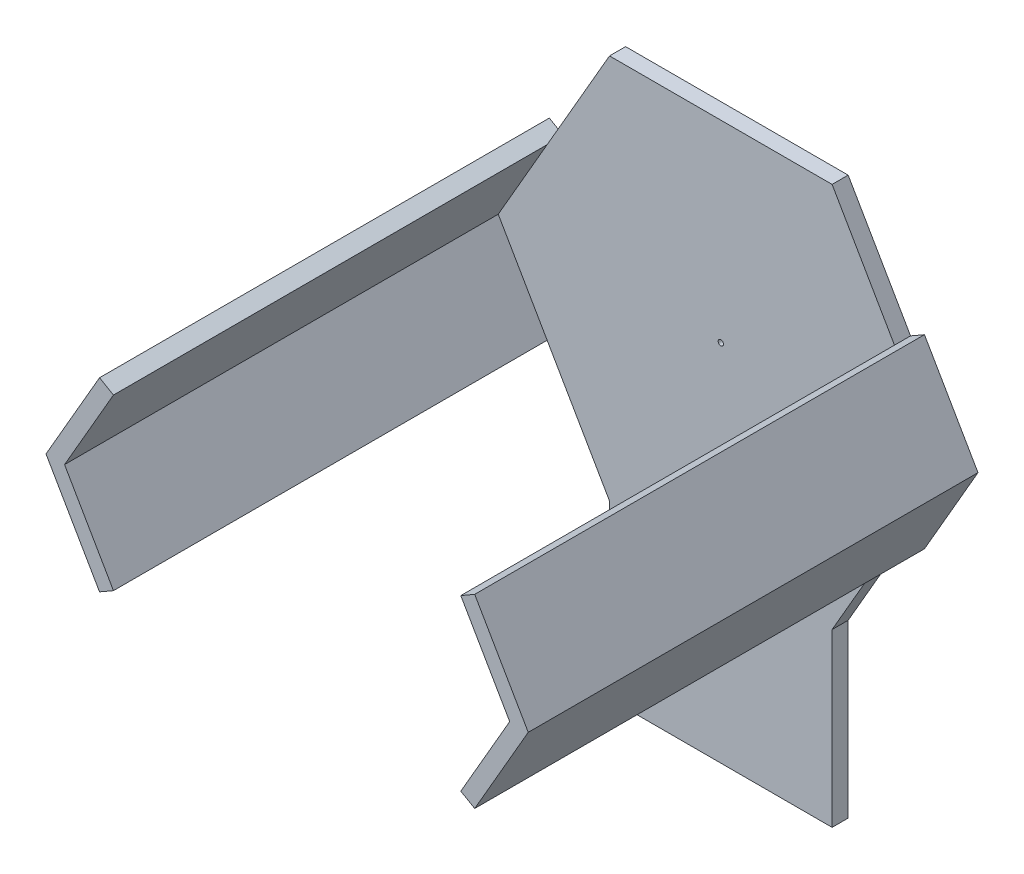
ISO-10303-21;
HEADER;
FILE_DESCRIPTION(('STEP AP214'),'2;1');
FILE_NAME('part.step','',(''),(''),'','','');
FILE_SCHEMA(('AUTOMOTIVE_DESIGN { 1 0 10303 214 1 1 1 1 }'));
ENDSEC;
DATA;
#1=APPLICATION_CONTEXT('core data for automotive mechanical design processes');
#2=APPLICATION_PROTOCOL_DEFINITION('international standard','automotive_design',2000,#1);
#3=PRODUCT_CONTEXT('',#1,'mechanical');
#4=PRODUCT('Part','Part','',(#3));
#5=PRODUCT_RELATED_PRODUCT_CATEGORY('part','',(#4));
#6=PRODUCT_DEFINITION_FORMATION('','',#4);
#7=PRODUCT_DEFINITION_CONTEXT('part definition',#1,'design');
#8=PRODUCT_DEFINITION('design','',#6,#7);
#9=PRODUCT_DEFINITION_SHAPE('','',#8);
#10=(LENGTH_UNIT() NAMED_UNIT(*) SI_UNIT(.MILLI.,.METRE.));
#11=(NAMED_UNIT(*) PLANE_ANGLE_UNIT() SI_UNIT($,.RADIAN.));
#12=(NAMED_UNIT(*) SI_UNIT($,.STERADIAN.) SOLID_ANGLE_UNIT());
#13=UNCERTAINTY_MEASURE_WITH_UNIT(LENGTH_MEASURE(1.E-05),#10,'distance_accuracy_value','');
#14=(GEOMETRIC_REPRESENTATION_CONTEXT(3) GLOBAL_UNCERTAINTY_ASSIGNED_CONTEXT((#13)) GLOBAL_UNIT_ASSIGNED_CONTEXT((#10,
#11,#12)) REPRESENTATION_CONTEXT('',''));
#15=CARTESIAN_POINT('',(0.,0.,0.));
#16=DIRECTION('',(0.,0.,1.));
#17=DIRECTION('',(1.,0.,0.));
#18=AXIS2_PLACEMENT_3D('',#15,#16,#17);
#19=CARTESIAN_POINT('',(197.973407305123,-114.3,533.4));
#20=DIRECTION('',(0.866025403784439,-0.5,0.));
#21=DIRECTION('',(0.5,0.866025403784439,0.));
#22=AXIS2_PLACEMENT_3D('',#19,#20,#21);
#23=PLANE('',#22);
#24=DIRECTION('',(-0.5,-0.866025403784439,0.));
#25=VECTOR('',#24,1.);
#26=CARTESIAN_POINT('',(197.973407305123,-114.3,0.));
#27=LINE('',#26,#25);
#28=CARTESIAN_POINT('',(263.964543073497,3.19189119579733E-13,0.));
#29=VERTEX_POINT('',#28);
#30=CARTESIAN_POINT('',(205.963804387528,-100.460226280625,0.));
#31=VERTEX_POINT('',#30);
#32=EDGE_CURVE('E129',#29,#31,#27,.T.);
#33=ORIENTED_EDGE('',*,*,#32,.T.);
#34=DIRECTION('',(0.,0.,-1.));
#35=VECTOR('',#34,1.);
#36=CARTESIAN_POINT('',(205.963804387528,-100.460226280625,533.4));
#37=LINE('',#36,#35);
#38=CARTESIAN_POINT('',(205.963804387528,-100.460226280625,533.4));
#39=VERTEX_POINT('',#38);
#40=EDGE_CURVE('E12',#39,#31,#37,.T.);
#41=ORIENTED_EDGE('',*,*,#40,.F.);
#42=DIRECTION('',(-0.5,-0.866025403784439,0.));
#43=VECTOR('',#42,1.);
#44=CARTESIAN_POINT('',(197.973407305123,-114.3,533.4));
#45=LINE('',#44,#43);
#46=CARTESIAN_POINT('',(263.964543073497,3.19189119579733E-13,533.4));
#47=VERTEX_POINT('',#46);
#48=EDGE_CURVE('E140',#47,#39,#45,.T.);
#49=ORIENTED_EDGE('',*,*,#48,.F.);
#50=DIRECTION('',(0.,0.,-1.));
#51=VECTOR('',#50,1.);
#52=CARTESIAN_POINT('',(263.964543073497,3.19189119579733E-13,533.4));
#53=LINE('',#52,#51);
#54=EDGE_CURVE('E49',#47,#29,#53,.T.);
#55=ORIENTED_EDGE('',*,*,#54,.T.);
#56=EDGE_LOOP('',(#33,#41,#49,#55));
#57=FACE_BOUND('',#56,.T.);
#58=ADVANCED_FACE('F46',(#57),#23,.F.);
#59=CARTESIAN_POINT('',(7.99039708240459,13.8397737193749,533.4));
#60=DIRECTION('',(0.499999999999998,0.86602540378444,0.));
#61=DIRECTION('',(-0.86602540378444,0.499999999999998,0.));
#62=AXIS2_PLACEMENT_3D('',#59,#60,#61);
#63=PLANE('',#62);
#64=DIRECTION('',(0.86602540378444,-0.499999999999998,0.));
#65=VECTOR('',#64,1.);
#66=CARTESIAN_POINT('',(7.99039708240459,13.8397737193749,0.));
#67=LINE('',#66,#65);
#68=CARTESIAN_POINT('',(222.461588329621,-109.985226280624,0.));
#69=VERTEX_POINT('',#68);
#70=EDGE_CURVE('E83',#31,#69,#67,.T.);
#71=ORIENTED_EDGE('',*,*,#70,.T.);
#72=DIRECTION('',(0.,0.,-1.));
#73=VECTOR('',#72,1.);
#74=CARTESIAN_POINT('',(222.461588329621,-109.985226280624,533.4));
#75=LINE('',#74,#73);
#76=CARTESIAN_POINT('',(222.461588329621,-109.985226280624,533.4));
#77=VERTEX_POINT('',#76);
#78=EDGE_CURVE('E55',#77,#69,#75,.T.);
#79=ORIENTED_EDGE('',*,*,#78,.F.);
#80=DIRECTION('',(0.86602540378444,-0.499999999999998,0.));
#81=VECTOR('',#80,1.);
#82=CARTESIAN_POINT('',(7.99039708240459,13.8397737193749,533.4));
#83=LINE('',#82,#81);
#84=EDGE_CURVE('E63',#39,#77,#83,.T.);
#85=ORIENTED_EDGE('',*,*,#84,.F.);
#86=ORIENTED_EDGE('',*,*,#40,.T.);
#87=EDGE_LOOP('',(#71,#79,#85,#86));
#88=FACE_BOUND('',#87,.T.);
#89=ADVANCED_FACE('F156',(#88),#63,.F.);
#90=CARTESIAN_POINT('',(214.471191247216,-123.825,533.4));
#91=DIRECTION('',(-0.866025403784439,0.5,0.));
#92=DIRECTION('',(-0.5,-0.866025403784439,0.));
#93=AXIS2_PLACEMENT_3D('',#90,#91,#92);
#94=PLANE('',#93);
#95=DIRECTION('',(0.5,0.866025403784439,0.));
#96=VECTOR('',#95,1.);
#97=CARTESIAN_POINT('',(214.471191247216,-123.825,0.));
#98=LINE('',#97,#96);
#99=CARTESIAN_POINT('',(285.961588329621,-4.9960036108132E-13,0.));
#100=VERTEX_POINT('',#99);
#101=EDGE_CURVE('E116',#69,#100,#98,.T.);
#102=ORIENTED_EDGE('',*,*,#101,.T.);
#103=DIRECTION('',(0.,0.,-1.));
#104=VECTOR('',#103,1.);
#105=CARTESIAN_POINT('',(285.961588329621,-4.9960036108132E-13,533.4));
#106=LINE('',#105,#104);
#107=CARTESIAN_POINT('',(285.961588329621,-4.9960036108132E-13,533.4));
#108=VERTEX_POINT('',#107);
#109=EDGE_CURVE('E114',#108,#100,#106,.T.);
#110=ORIENTED_EDGE('',*,*,#109,.F.);
#111=DIRECTION('',(0.5,0.866025403784439,0.));
#112=VECTOR('',#111,1.);
#113=CARTESIAN_POINT('',(214.471191247216,-123.825,533.4));
#114=LINE('',#113,#112);
#115=EDGE_CURVE('E105',#77,#108,#114,.T.);
#116=ORIENTED_EDGE('',*,*,#115,.F.);
#117=ORIENTED_EDGE('',*,*,#78,.T.);
#118=EDGE_LOOP('',(#102,#110,#116,#117));
#119=FACE_BOUND('',#118,.T.);
#120=ADVANCED_FACE('F115',(#119),#94,.F.);
#121=CARTESIAN_POINT('',(214.471191247216,123.824999999999,533.4));
#122=DIRECTION('',(0.866025403784441,0.499999999999996,0.));
#123=DIRECTION('',(-0.499999999999996,0.866025403784441,0.));
#124=AXIS2_PLACEMENT_3D('',#121,#122,#123);
#125=PLANE('',#124);
#126=DIRECTION('',(0.499999999999996,-0.866025403784441,0.));
#127=VECTOR('',#126,1.);
#128=CARTESIAN_POINT('',(214.471191247216,123.824999999999,0.));
#129=LINE('',#128,#127);
#130=CARTESIAN_POINT('',(222.461588329621,109.985226280624,0.));
#131=VERTEX_POINT('',#130);
#132=EDGE_CURVE('E137',#131,#100,#129,.T.);
#133=ORIENTED_EDGE('',*,*,#132,.F.);
#134=DIRECTION('',(0.,0.,-1.));
#135=VECTOR('',#134,1.);
#136=CARTESIAN_POINT('',(222.461588329621,109.985226280624,533.4));
#137=LINE('',#136,#135);
#138=CARTESIAN_POINT('',(222.461588329621,109.985226280624,533.4));
#139=VERTEX_POINT('',#138);
#140=EDGE_CURVE('E120',#139,#131,#137,.T.);
#141=ORIENTED_EDGE('',*,*,#140,.F.);
#142=DIRECTION('',(0.499999999999996,-0.866025403784441,0.));
#143=VECTOR('',#142,1.);
#144=CARTESIAN_POINT('',(214.471191247216,123.824999999999,533.4));
#145=LINE('',#144,#143);
#146=EDGE_CURVE('E109',#139,#108,#145,.T.);
#147=ORIENTED_EDGE('',*,*,#146,.T.);
#148=ORIENTED_EDGE('',*,*,#109,.T.);
#149=EDGE_LOOP('',(#133,#141,#147,#148));
#150=FACE_BOUND('',#149,.T.);
#151=ADVANCED_FACE('F122',(#150),#125,.T.);
#152=CARTESIAN_POINT('',(7.99039708240474,-13.8397737193753,533.4));
#153=DIRECTION('',(-0.499999999999996,0.866025403784441,0.));
#154=DIRECTION('',(-0.866025403784441,-0.499999999999996,0.));
#155=AXIS2_PLACEMENT_3D('',#152,#153,#154);
#156=PLANE('',#155);
#157=DIRECTION('',(0.866025403784441,0.499999999999996,0.));
#158=VECTOR('',#157,1.);
#159=CARTESIAN_POINT('',(7.99039708240474,-13.8397737193753,0.));
#160=LINE('',#159,#158);
#161=CARTESIAN_POINT('',(205.963804387528,100.460226280624,0.));
#162=VERTEX_POINT('',#161);
#163=EDGE_CURVE('E134',#162,#131,#160,.T.);
#164=ORIENTED_EDGE('',*,*,#163,.F.);
#165=DIRECTION('',(0.,0.,-1.));
#166=VECTOR('',#165,1.);
#167=CARTESIAN_POINT('',(205.963804387528,100.460226280624,533.4));
#168=LINE('',#167,#166);
#169=CARTESIAN_POINT('',(205.963804387528,100.460226280624,533.4));
#170=VERTEX_POINT('',#169);
#171=EDGE_CURVE('E143',#170,#162,#168,.T.);
#172=ORIENTED_EDGE('',*,*,#171,.F.);
#173=DIRECTION('',(0.866025403784441,0.499999999999996,0.));
#174=VECTOR('',#173,1.);
#175=CARTESIAN_POINT('',(7.99039708240474,-13.8397737193753,533.4));
#176=LINE('',#175,#174);
#177=EDGE_CURVE('E123',#170,#139,#176,.T.);
#178=ORIENTED_EDGE('',*,*,#177,.T.);
#179=ORIENTED_EDGE('',*,*,#140,.T.);
#180=EDGE_LOOP('',(#164,#172,#178,#179));
#181=FACE_BOUND('',#180,.T.);
#182=ADVANCED_FACE('F153',(#181),#156,.T.);
#183=CARTESIAN_POINT('',(197.973407305123,114.3,533.4));
#184=DIRECTION('',(0.866025403784439,0.5,0.));
#185=DIRECTION('',(-0.5,0.866025403784439,0.));
#186=AXIS2_PLACEMENT_3D('',#183,#184,#185);
#187=PLANE('',#186);
#188=DIRECTION('',(0.5,-0.866025403784439,0.));
#189=VECTOR('',#188,1.);
#190=CARTESIAN_POINT('',(197.973407305123,114.3,0.));
#191=LINE('',#190,#189);
#192=EDGE_CURVE('E132',#162,#29,#191,.T.);
#193=ORIENTED_EDGE('',*,*,#192,.T.);
#194=ORIENTED_EDGE('',*,*,#54,.F.);
#195=DIRECTION('',(0.5,-0.866025403784439,0.));
#196=VECTOR('',#195,1.);
#197=CARTESIAN_POINT('',(197.973407305123,114.3,533.4));
#198=LINE('',#197,#196);
#199=EDGE_CURVE('E95',#170,#47,#198,.T.);
#200=ORIENTED_EDGE('',*,*,#199,.F.);
#201=ORIENTED_EDGE('',*,*,#171,.T.);
#202=EDGE_LOOP('',(#193,#194,#200,#201));
#203=FACE_BOUND('',#202,.T.);
#204=ADVANCED_FACE('F154',(#203),#187,.F.);
#205=CARTESIAN_POINT('',(0.,0.,533.4));
#206=DIRECTION('',(0.,0.,-1.));
#207=DIRECTION('',(-1.,0.,0.));
#208=AXIS2_PLACEMENT_3D('',#205,#206,#207);
#209=PLANE('',#208);
#210=ORIENTED_EDGE('',*,*,#48,.T.);
#211=ORIENTED_EDGE('',*,*,#84,.T.);
#212=ORIENTED_EDGE('',*,*,#115,.T.);
#213=ORIENTED_EDGE('',*,*,#146,.F.);
#214=ORIENTED_EDGE('',*,*,#177,.F.);
#215=ORIENTED_EDGE('',*,*,#199,.T.);
#216=EDGE_LOOP('',(#210,#211,#212,#213,#214,#215));
#217=FACE_BOUND('',#216,.T.);
#218=ADVANCED_FACE('F107',(#217),#209,.F.);
#219=CARTESIAN_POINT('',(0.,0.,0.));
#220=DIRECTION('',(0.,0.,-1.));
#221=DIRECTION('',(-1.,0.,0.));
#222=AXIS2_PLACEMENT_3D('',#219,#220,#221);
#223=PLANE('',#222);
#224=ORIENTED_EDGE('',*,*,#32,.F.);
#225=ORIENTED_EDGE('',*,*,#192,.F.);
#226=ORIENTED_EDGE('',*,*,#163,.T.);
#227=ORIENTED_EDGE('',*,*,#132,.T.);
#228=ORIENTED_EDGE('',*,*,#101,.F.);
#229=ORIENTED_EDGE('',*,*,#70,.F.);
#230=EDGE_LOOP('',(#224,#225,#226,#227,#228,#229));
#231=FACE_BOUND('',#230,.T.);
#232=ADVANCED_FACE('F150',(#231),#223,.T.);
#233=CLOSED_SHELL('',(#58,#89,#120,#151,#182,#204,#218,#232));
#234=MANIFOLD_SOLID_BREP('B2',#233);
#235=CARTESIAN_POINT('',(-214.471191247216,-123.824999999999,533.4));
#236=DIRECTION('',(-0.866025403784439,-0.499999999999999,0.));
#237=DIRECTION('',(0.499999999999999,-0.866025403784439,0.));
#238=AXIS2_PLACEMENT_3D('',#235,#236,#237);
#239=PLANE('',#238);
#240=DIRECTION('',(-0.499999999999999,0.866025403784439,0.));
#241=VECTOR('',#240,1.);
#242=CARTESIAN_POINT('',(-214.471191247216,-123.824999999999,0.));
#243=LINE('',#242,#241);
#244=CARTESIAN_POINT('',(-222.461588329621,-109.985226280624,0.));
#245=VERTEX_POINT('',#244);
#246=CARTESIAN_POINT('',(-285.96158832962,-4.30211422042248E-13,0.));
#247=VERTEX_POINT('',#246);
#248=EDGE_CURVE('E325',#245,#247,#243,.T.);
#249=ORIENTED_EDGE('',*,*,#248,.F.);
#250=DIRECTION('',(0.,0.,-1.));
#251=VECTOR('',#250,1.);
#252=CARTESIAN_POINT('',(-222.461588329621,-109.985226280624,533.4));
#253=LINE('',#252,#251);
#254=CARTESIAN_POINT('',(-222.461588329621,-109.985226280624,533.4));
#255=VERTEX_POINT('',#254);
#256=EDGE_CURVE('E44',#255,#245,#253,.T.);
#257=ORIENTED_EDGE('',*,*,#256,.F.);
#258=DIRECTION('',(-0.499999999999999,0.866025403784439,0.));
#259=VECTOR('',#258,1.);
#260=CARTESIAN_POINT('',(-214.471191247216,-123.824999999999,533.4));
#261=LINE('',#260,#259);
#262=CARTESIAN_POINT('',(-285.96158832962,-4.30211422042248E-13,533.4));
#263=VERTEX_POINT('',#262);
#264=EDGE_CURVE('E338',#255,#263,#261,.T.);
#265=ORIENTED_EDGE('',*,*,#264,.T.);
#266=DIRECTION('',(0.,0.,-1.));
#267=VECTOR('',#266,1.);
#268=CARTESIAN_POINT('',(-285.96158832962,-4.30211422042248E-13,533.4));
#269=LINE('',#268,#267);
#270=EDGE_CURVE('E246',#263,#247,#269,.T.);
#271=ORIENTED_EDGE('',*,*,#270,.T.);
#272=EDGE_LOOP('',(#249,#257,#265,#271));
#273=FACE_BOUND('',#272,.T.);
#274=ADVANCED_FACE('F243',(#273),#239,.T.);
#275=CARTESIAN_POINT('',(-7.99039708240463,13.839773719375,533.4));
#276=DIRECTION('',(0.499999999999998,-0.86602540378444,0.));
#277=DIRECTION('',(0.86602540378444,0.499999999999998,0.));
#278=AXIS2_PLACEMENT_3D('',#275,#276,#277);
#279=PLANE('',#278);
#280=DIRECTION('',(-0.86602540378444,-0.499999999999998,0.));
#281=VECTOR('',#280,1.);
#282=CARTESIAN_POINT('',(-7.99039708240463,13.839773719375,0.));
#283=LINE('',#282,#281);
#284=CARTESIAN_POINT('',(-205.963804387528,-100.460226280625,0.));
#285=VERTEX_POINT('',#284);
#286=EDGE_CURVE('E336',#285,#245,#283,.T.);
#287=ORIENTED_EDGE('',*,*,#286,.F.);
#288=DIRECTION('',(0.,0.,-1.));
#289=VECTOR('',#288,1.);
#290=CARTESIAN_POINT('',(-205.963804387528,-100.460226280625,533.4));
#291=LINE('',#290,#289);
#292=CARTESIAN_POINT('',(-205.963804387528,-100.460226280625,533.4));
#293=VERTEX_POINT('',#292);
#294=EDGE_CURVE('E252',#293,#285,#291,.T.);
#295=ORIENTED_EDGE('',*,*,#294,.F.);
#296=DIRECTION('',(-0.86602540378444,-0.499999999999998,0.));
#297=VECTOR('',#296,1.);
#298=CARTESIAN_POINT('',(-7.99039708240463,13.839773719375,533.4));
#299=LINE('',#298,#297);
#300=EDGE_CURVE('E306',#293,#255,#299,.T.);
#301=ORIENTED_EDGE('',*,*,#300,.T.);
#302=ORIENTED_EDGE('',*,*,#256,.T.);
#303=EDGE_LOOP('',(#287,#295,#301,#302));
#304=FACE_BOUND('',#303,.T.);
#305=ADVANCED_FACE('F350',(#304),#279,.T.);
#306=CARTESIAN_POINT('',(-197.973407305123,-114.3,533.4));
#307=DIRECTION('',(-0.866025403784438,-0.5,0.));
#308=DIRECTION('',(0.5,-0.866025403784438,0.));
#309=AXIS2_PLACEMENT_3D('',#306,#307,#308);
#310=PLANE('',#309);
#311=DIRECTION('',(-0.5,0.866025403784438,0.));
#312=VECTOR('',#311,1.);
#313=CARTESIAN_POINT('',(-197.973407305123,-114.3,0.));
#314=LINE('',#313,#312);
#315=CARTESIAN_POINT('',(-263.964543073497,-7.21644966006352E-13,0.));
#316=VERTEX_POINT('',#315);
#317=EDGE_CURVE('E311',#285,#316,#314,.T.);
#318=ORIENTED_EDGE('',*,*,#317,.T.);
#319=DIRECTION('',(0.,0.,-1.));
#320=VECTOR('',#319,1.);
#321=CARTESIAN_POINT('',(-263.964543073497,-7.21644966006352E-13,533.4));
#322=LINE('',#321,#320);
#323=CARTESIAN_POINT('',(-263.964543073497,-7.21644966006352E-13,533.4));
#324=VERTEX_POINT('',#323);
#325=EDGE_CURVE('E309',#324,#316,#322,.T.);
#326=ORIENTED_EDGE('',*,*,#325,.F.);
#327=DIRECTION('',(-0.5,0.866025403784438,0.));
#328=VECTOR('',#327,1.);
#329=CARTESIAN_POINT('',(-197.973407305123,-114.3,533.4));
#330=LINE('',#329,#328);
#331=EDGE_CURVE('E300',#293,#324,#330,.T.);
#332=ORIENTED_EDGE('',*,*,#331,.F.);
#333=ORIENTED_EDGE('',*,*,#294,.T.);
#334=EDGE_LOOP('',(#318,#326,#332,#333));
#335=FACE_BOUND('',#334,.T.);
#336=ADVANCED_FACE('F310',(#335),#310,.F.);
#337=CARTESIAN_POINT('',(-197.973407305123,114.3,533.4));
#338=DIRECTION('',(-0.866025403784439,0.499999999999999,0.));
#339=DIRECTION('',(-0.499999999999999,-0.866025403784439,0.));
#340=AXIS2_PLACEMENT_3D('',#337,#338,#339);
#341=PLANE('',#340);
#342=DIRECTION('',(0.499999999999999,0.866025403784439,0.));
#343=VECTOR('',#342,1.);
#344=CARTESIAN_POINT('',(-197.973407305123,114.3,0.));
#345=LINE('',#344,#343);
#346=CARTESIAN_POINT('',(-205.963804387528,100.460226280624,0.));
#347=VERTEX_POINT('',#346);
#348=EDGE_CURVE('E333',#316,#347,#345,.T.);
#349=ORIENTED_EDGE('',*,*,#348,.T.);
#350=DIRECTION('',(0.,0.,-1.));
#351=VECTOR('',#350,1.);
#352=CARTESIAN_POINT('',(-205.963804387528,100.460226280624,533.4));
#353=LINE('',#352,#351);
#354=CARTESIAN_POINT('',(-205.963804387528,100.460226280624,533.4));
#355=VERTEX_POINT('',#354);
#356=EDGE_CURVE('E314',#355,#347,#353,.T.);
#357=ORIENTED_EDGE('',*,*,#356,.F.);
#358=DIRECTION('',(0.499999999999999,0.866025403784439,0.));
#359=VECTOR('',#358,1.);
#360=CARTESIAN_POINT('',(-197.973407305123,114.3,533.4));
#361=LINE('',#360,#359);
#362=EDGE_CURVE('E304',#324,#355,#361,.T.);
#363=ORIENTED_EDGE('',*,*,#362,.F.);
#364=ORIENTED_EDGE('',*,*,#325,.T.);
#365=EDGE_LOOP('',(#349,#357,#363,#364));
#366=FACE_BOUND('',#365,.T.);
#367=ADVANCED_FACE('F316',(#366),#341,.F.);
#368=CARTESIAN_POINT('',(-7.99039708240472,-13.8397737193752,533.4));
#369=DIRECTION('',(-0.499999999999996,-0.866025403784441,0.));
#370=DIRECTION('',(0.866025403784441,-0.499999999999996,0.));
#371=AXIS2_PLACEMENT_3D('',#368,#369,#370);
#372=PLANE('',#371);
#373=DIRECTION('',(-0.866025403784441,0.499999999999996,0.));
#374=VECTOR('',#373,1.);
#375=CARTESIAN_POINT('',(-7.99039708240472,-13.8397737193752,0.));
#376=LINE('',#375,#374);
#377=CARTESIAN_POINT('',(-222.461588329621,109.985226280624,0.));
#378=VERTEX_POINT('',#377);
#379=EDGE_CURVE('E331',#347,#378,#376,.T.);
#380=ORIENTED_EDGE('',*,*,#379,.T.);
#381=DIRECTION('',(0.,0.,-1.));
#382=VECTOR('',#381,1.);
#383=CARTESIAN_POINT('',(-222.461588329621,109.985226280624,533.4));
#384=LINE('',#383,#382);
#385=CARTESIAN_POINT('',(-222.461588329621,109.985226280624,533.4));
#386=VERTEX_POINT('',#385);
#387=EDGE_CURVE('E341',#386,#378,#384,.T.);
#388=ORIENTED_EDGE('',*,*,#387,.F.);
#389=DIRECTION('',(-0.866025403784441,0.499999999999996,0.));
#390=VECTOR('',#389,1.);
#391=CARTESIAN_POINT('',(-7.99039708240472,-13.8397737193752,533.4));
#392=LINE('',#391,#390);
#393=EDGE_CURVE('E319',#355,#386,#392,.T.);
#394=ORIENTED_EDGE('',*,*,#393,.F.);
#395=ORIENTED_EDGE('',*,*,#356,.T.);
#396=EDGE_LOOP('',(#380,#388,#394,#395));
#397=FACE_BOUND('',#396,.T.);
#398=ADVANCED_FACE('F363',(#397),#372,.F.);
#399=CARTESIAN_POINT('',(-214.471191247216,123.824999999999,533.4));
#400=DIRECTION('',(0.866025403784441,-0.499999999999996,0.));
#401=DIRECTION('',(0.499999999999996,0.866025403784441,0.));
#402=AXIS2_PLACEMENT_3D('',#399,#400,#401);
#403=PLANE('',#402);
#404=DIRECTION('',(-0.499999999999996,-0.866025403784441,0.));
#405=VECTOR('',#404,1.);
#406=CARTESIAN_POINT('',(-214.471191247216,123.824999999999,0.));
#407=LINE('',#406,#405);
#408=EDGE_CURVE('E328',#378,#247,#407,.T.);
#409=ORIENTED_EDGE('',*,*,#408,.T.);
#410=ORIENTED_EDGE('',*,*,#270,.F.);
#411=DIRECTION('',(-0.499999999999996,-0.866025403784441,0.));
#412=VECTOR('',#411,1.);
#413=CARTESIAN_POINT('',(-214.471191247216,123.824999999999,533.4));
#414=LINE('',#413,#412);
#415=EDGE_CURVE('E292',#386,#263,#414,.T.);
#416=ORIENTED_EDGE('',*,*,#415,.F.);
#417=ORIENTED_EDGE('',*,*,#387,.T.);
#418=EDGE_LOOP('',(#409,#410,#416,#417));
#419=FACE_BOUND('',#418,.T.);
#420=ADVANCED_FACE('F346',(#419),#403,.F.);
#421=CARTESIAN_POINT('',(0.,0.,533.4));
#422=DIRECTION('',(0.,0.,-1.));
#423=DIRECTION('',(-1.,0.,0.));
#424=AXIS2_PLACEMENT_3D('',#421,#422,#423);
#425=PLANE('',#424);
#426=ORIENTED_EDGE('',*,*,#264,.F.);
#427=ORIENTED_EDGE('',*,*,#300,.F.);
#428=ORIENTED_EDGE('',*,*,#331,.T.);
#429=ORIENTED_EDGE('',*,*,#362,.T.);
#430=ORIENTED_EDGE('',*,*,#393,.T.);
#431=ORIENTED_EDGE('',*,*,#415,.T.);
#432=EDGE_LOOP('',(#426,#427,#428,#429,#430,#431));
#433=FACE_BOUND('',#432,.T.);
#434=ADVANCED_FACE('F302',(#433),#425,.F.);
#435=CARTESIAN_POINT('',(0.,0.,0.));
#436=DIRECTION('',(0.,0.,-1.));
#437=DIRECTION('',(-1.,0.,0.));
#438=AXIS2_PLACEMENT_3D('',#435,#436,#437);
#439=PLANE('',#438);
#440=ORIENTED_EDGE('',*,*,#248,.T.);
#441=ORIENTED_EDGE('',*,*,#408,.F.);
#442=ORIENTED_EDGE('',*,*,#379,.F.);
#443=ORIENTED_EDGE('',*,*,#348,.F.);
#444=ORIENTED_EDGE('',*,*,#317,.F.);
#445=ORIENTED_EDGE('',*,*,#286,.T.);
#446=EDGE_LOOP('',(#440,#441,#442,#443,#444,#445));
#447=FACE_BOUND('',#446,.T.);
#448=ADVANCED_FACE('F349',(#447),#439,.T.);
#449=CLOSED_SHELL('',(#274,#305,#336,#367,#398,#420,#434,#448));
#450=MANIFOLD_SOLID_BREP('B6',#449);
#451=CARTESIAN_POINT('',(-197.973407305123,114.3,19.05));
#452=DIRECTION('',(-0.866025403784439,0.499999999999999,0.));
#453=DIRECTION('',(-0.499999999999999,-0.866025403784439,0.));
#454=AXIS2_PLACEMENT_3D('',#451,#452,#453);
#455=PLANE('',#454);
#456=DIRECTION('',(0.499999999999999,0.866025403784439,0.));
#457=VECTOR('',#456,1.);
#458=CARTESIAN_POINT('',(-197.973407305123,114.3,0.));
#459=LINE('',#458,#457);
#460=CARTESIAN_POINT('',(-263.964543073497,-7.35522753814166E-13,0.));
#461=VERTEX_POINT('',#460);
#462=CARTESIAN_POINT('',(-131.982271536748,228.6,0.));
#463=VERTEX_POINT('',#462);
#464=EDGE_CURVE('E514',#461,#463,#459,.T.);
#465=ORIENTED_EDGE('',*,*,#464,.F.);
#466=DIRECTION('',(0.,0.,-1.));
#467=VECTOR('',#466,1.);
#468=CARTESIAN_POINT('',(-263.964543073497,-7.35522753814166E-13,19.05));
#469=LINE('',#468,#467);
#470=CARTESIAN_POINT('',(-263.964543073497,-7.35522753814166E-13,19.05));
#471=VERTEX_POINT('',#470);
#472=EDGE_CURVE('E241',#471,#461,#469,.T.);
#473=ORIENTED_EDGE('',*,*,#472,.F.);
#474=DIRECTION('',(0.499999999999999,0.866025403784439,0.));
#475=VECTOR('',#474,1.);
#476=CARTESIAN_POINT('',(-197.973407305123,114.3,19.05));
#477=LINE('',#476,#475);
#478=CARTESIAN_POINT('',(-131.982271536748,228.6,19.05));
#479=VERTEX_POINT('',#478);
#480=EDGE_CURVE('E526',#471,#479,#477,.T.);
#481=ORIENTED_EDGE('',*,*,#480,.T.);
#482=DIRECTION('',(0.,0.,-1.));
#483=VECTOR('',#482,1.);
#484=CARTESIAN_POINT('',(-131.982271536748,228.6,19.05));
#485=LINE('',#484,#483);
#486=EDGE_CURVE('E447',#479,#463,#485,.T.);
#487=ORIENTED_EDGE('',*,*,#486,.T.);
#488=EDGE_LOOP('',(#465,#473,#481,#487));
#489=FACE_BOUND('',#488,.T.);
#490=ADVANCED_FACE('F431',(#489),#455,.T.);
#491=CARTESIAN_POINT('',(-197.973407305123,-114.3,19.05));
#492=DIRECTION('',(-0.866025403784438,-0.5,0.));
#493=DIRECTION('',(0.5,-0.866025403784438,0.));
#494=AXIS2_PLACEMENT_3D('',#491,#492,#493);
#495=PLANE('',#494);
#496=DIRECTION('',(-0.5,0.866025403784438,0.));
#497=VECTOR('',#496,1.);
#498=CARTESIAN_POINT('',(-197.973407305123,-114.3,0.));
#499=LINE('',#498,#497);
#500=CARTESIAN_POINT('',(-131.982271536748,-228.6,0.));
#501=VERTEX_POINT('',#500);
#502=EDGE_CURVE('E516',#501,#461,#499,.T.);
#503=ORIENTED_EDGE('',*,*,#502,.F.);
#504=DIRECTION('',(0.,0.,-1.));
#505=VECTOR('',#504,1.);
#506=CARTESIAN_POINT('',(-131.982271536748,-228.6,19.05));
#507=LINE('',#506,#505);
#508=CARTESIAN_POINT('',(-131.982271536748,-228.6,19.05));
#509=VERTEX_POINT('',#508);
#510=EDGE_CURVE('E439',#509,#501,#507,.T.);
#511=ORIENTED_EDGE('',*,*,#510,.F.);
#512=DIRECTION('',(-0.5,0.866025403784438,0.));
#513=VECTOR('',#512,1.);
#514=CARTESIAN_POINT('',(-197.973407305123,-114.3,19.05));
#515=LINE('',#514,#513);
#516=EDGE_CURVE('E506',#509,#471,#515,.T.);
#517=ORIENTED_EDGE('',*,*,#516,.T.);
#518=ORIENTED_EDGE('',*,*,#472,.T.);
#519=EDGE_LOOP('',(#503,#511,#517,#518));
#520=FACE_BOUND('',#519,.T.);
#521=ADVANCED_FACE('F570',(#520),#495,.T.);
#522=CARTESIAN_POINT('',(197.973407305123,-114.3,19.05));
#523=DIRECTION('',(0.866025403784439,-0.5,0.));
#524=DIRECTION('',(0.5,0.866025403784439,0.));
#525=AXIS2_PLACEMENT_3D('',#522,#523,#524);
#526=PLANE('',#525);
#527=DIRECTION('',(-0.5,-0.866025403784439,0.));
#528=VECTOR('',#527,1.);
#529=CARTESIAN_POINT('',(197.973407305123,-114.3,0.));
#530=LINE('',#529,#528);
#531=CARTESIAN_POINT('',(263.964543073497,6.10622663543836E-13,0.));
#532=VERTEX_POINT('',#531);
#533=CARTESIAN_POINT('',(131.982271536749,-228.599999999999,0.));
#534=VERTEX_POINT('',#533);
#535=EDGE_CURVE('E491',#532,#534,#530,.T.);
#536=ORIENTED_EDGE('',*,*,#535,.F.);
#537=DIRECTION('',(0.,0.,-1.));
#538=VECTOR('',#537,1.);
#539=CARTESIAN_POINT('',(263.964543073497,6.10622663543836E-13,19.05));
#540=LINE('',#539,#538);
#541=CARTESIAN_POINT('',(263.964543073497,6.10622663543836E-13,19.05));
#542=VERTEX_POINT('',#541);
#543=EDGE_CURVE('E485',#542,#532,#540,.T.);
#544=ORIENTED_EDGE('',*,*,#543,.F.);
#545=DIRECTION('',(-0.5,-0.866025403784439,0.));
#546=VECTOR('',#545,1.);
#547=CARTESIAN_POINT('',(197.973407305123,-114.3,19.05));
#548=LINE('',#547,#546);
#549=CARTESIAN_POINT('',(131.982271536749,-228.599999999999,19.05));
#550=VERTEX_POINT('',#549);
#551=EDGE_CURVE('E488',#542,#550,#548,.T.);
#552=ORIENTED_EDGE('',*,*,#551,.T.);
#553=DIRECTION('',(0.,0.,-1.));
#554=VECTOR('',#553,1.);
#555=CARTESIAN_POINT('',(131.982271536749,-228.599999999999,19.05));
#556=LINE('',#555,#554);
#557=EDGE_CURVE('E495',#550,#534,#556,.T.);
#558=ORIENTED_EDGE('',*,*,#557,.T.);
#559=EDGE_LOOP('',(#536,#544,#552,#558));
#560=FACE_BOUND('',#559,.T.);
#561=ADVANCED_FACE('F487',(#560),#526,.T.);
#562=CARTESIAN_POINT('',(197.973407305123,114.3,19.05));
#563=DIRECTION('',(0.866025403784439,0.5,0.));
#564=DIRECTION('',(-0.5,0.866025403784438,0.));
#565=AXIS2_PLACEMENT_3D('',#562,#563,#564);
#566=PLANE('',#565);
#567=DIRECTION('',(0.5,-0.866025403784439,0.));
#568=VECTOR('',#567,1.);
#569=CARTESIAN_POINT('',(197.973407305123,114.3,0.));
#570=LINE('',#569,#568);
#571=CARTESIAN_POINT('',(131.982271536748,228.6,0.));
#572=VERTEX_POINT('',#571);
#573=EDGE_CURVE('E521',#572,#532,#570,.T.);
#574=ORIENTED_EDGE('',*,*,#573,.F.);
#575=DIRECTION('',(0.,0.,-1.));
#576=VECTOR('',#575,1.);
#577=CARTESIAN_POINT('',(131.982271536748,228.6,19.05));
#578=LINE('',#577,#576);
#579=CARTESIAN_POINT('',(131.982271536748,228.6,19.05));
#580=VERTEX_POINT('',#579);
#581=EDGE_CURVE('E464',#580,#572,#578,.T.);
#582=ORIENTED_EDGE('',*,*,#581,.F.);
#583=DIRECTION('',(0.5,-0.866025403784439,0.));
#584=VECTOR('',#583,1.);
#585=CARTESIAN_POINT('',(197.973407305123,114.3,19.05));
#586=LINE('',#585,#584);
#587=EDGE_CURVE('E502',#580,#542,#586,.T.);
#588=ORIENTED_EDGE('',*,*,#587,.T.);
#589=ORIENTED_EDGE('',*,*,#543,.T.);
#590=EDGE_LOOP('',(#574,#582,#588,#589));
#591=FACE_BOUND('',#590,.T.);
#592=ADVANCED_FACE('F508',(#591),#566,.T.);
#593=CARTESIAN_POINT('',(0.,228.6,19.05));
#594=DIRECTION('',(0.,1.,0.));
#595=DIRECTION('',(-1.,0.,0.));
#596=AXIS2_PLACEMENT_3D('',#593,#594,#595);
#597=PLANE('',#596);
#598=DIRECTION('',(1.,0.,0.));
#599=VECTOR('',#598,1.);
#600=CARTESIAN_POINT('',(0.,228.6,0.));
#601=LINE('',#600,#599);
#602=EDGE_CURVE('E523',#463,#572,#601,.T.);
#603=ORIENTED_EDGE('',*,*,#602,.F.);
#604=ORIENTED_EDGE('',*,*,#486,.F.);
#605=DIRECTION('',(1.,0.,0.));
#606=VECTOR('',#605,1.);
#607=CARTESIAN_POINT('',(0.,228.6,19.05));
#608=LINE('',#607,#606);
#609=EDGE_CURVE('E509',#479,#580,#608,.T.);
#610=ORIENTED_EDGE('',*,*,#609,.T.);
#611=ORIENTED_EDGE('',*,*,#581,.T.);
#612=EDGE_LOOP('',(#603,#604,#610,#611));
#613=FACE_BOUND('',#612,.T.);
#614=ADVANCED_FACE('F583',(#613),#597,.T.);
#615=CARTESIAN_POINT('',(0.,0.,19.05));
#616=DIRECTION('',(0.,0.,1.));
#617=DIRECTION('',(1.,0.,0.));
#618=AXIS2_PLACEMENT_3D('',#615,#616,#617);
#619=PLANE('',#618);
#620=CARTESIAN_POINT('',(0.,-320.802,19.05));
#621=DIRECTION('',(0.,0.,1.));
#622=DIRECTION('',(1.,0.,0.));
#623=AXIS2_PLACEMENT_3D('',#620,#621,#622);
#624=CIRCLE('',#623,3.175);
#625=CARTESIAN_POINT('',(3.175,-320.802,19.05));
#626=VERTEX_POINT('',#625);
#627=EDGE_CURVE('E617',#626,#626,#624,.T.);
#628=ORIENTED_EDGE('',*,*,#627,.F.);
#629=EDGE_LOOP('',(#628));
#630=FACE_BOUND('',#629,.T.);
#631=CARTESIAN_POINT('',(0.,0.,19.05));
#632=DIRECTION('',(0.,0.,1.));
#633=DIRECTION('',(1.,0.,0.));
#634=AXIS2_PLACEMENT_3D('',#631,#632,#633);
#635=CIRCLE('',#634,3.175);
#636=CARTESIAN_POINT('',(3.175,0.,19.05));
#637=VERTEX_POINT('',#636);
#638=EDGE_CURVE('E558',#637,#637,#635,.T.);
#639=ORIENTED_EDGE('',*,*,#638,.F.);
#640=EDGE_LOOP('',(#639));
#641=FACE_BOUND('',#640,.T.);
#642=ORIENTED_EDGE('',*,*,#480,.F.);
#643=ORIENTED_EDGE('',*,*,#516,.F.);
#644=DIRECTION('',(0.,-1.,0.));
#645=VECTOR('',#644,1.);
#646=CARTESIAN_POINT('',(-131.982271536748,-228.6,19.05));
#647=LINE('',#646,#645);
#648=CARTESIAN_POINT('',(-131.982271536748,-431.799999999999,19.05));
#649=VERTEX_POINT('',#648);
#650=EDGE_CURVE('E539',#509,#649,#647,.T.);
#651=ORIENTED_EDGE('',*,*,#650,.T.);
#652=DIRECTION('',(1.,0.,0.));
#653=VECTOR('',#652,1.);
#654=CARTESIAN_POINT('',(-131.982271536748,-431.799999999999,19.05));
#655=LINE('',#654,#653);
#656=CARTESIAN_POINT('',(131.982271536749,-431.799999999999,19.05));
#657=VERTEX_POINT('',#656);
#658=EDGE_CURVE('E555',#649,#657,#655,.T.);
#659=ORIENTED_EDGE('',*,*,#658,.T.);
#660=DIRECTION('',(0.,1.,0.));
#661=VECTOR('',#660,1.);
#662=CARTESIAN_POINT('',(131.982271536749,-228.599999999999,19.05));
#663=LINE('',#662,#661);
#664=EDGE_CURVE('E505',#657,#550,#663,.T.);
#665=ORIENTED_EDGE('',*,*,#664,.T.);
#666=ORIENTED_EDGE('',*,*,#551,.F.);
#667=ORIENTED_EDGE('',*,*,#587,.F.);
#668=ORIENTED_EDGE('',*,*,#609,.F.);
#669=EDGE_LOOP('',(#642,#643,#651,#659,#665,#666,#667,#668));
#670=FACE_BOUND('',#669,.T.);
#671=ADVANCED_FACE('F500',(#630,#641,#670),#619,.T.);
#672=CARTESIAN_POINT('',(0.,0.,0.));
#673=DIRECTION('',(0.,0.,1.));
#674=DIRECTION('',(1.,0.,0.));
#675=AXIS2_PLACEMENT_3D('',#672,#673,#674);
#676=PLANE('',#675);
#677=CARTESIAN_POINT('',(0.,-320.802,0.));
#678=DIRECTION('',(0.,0.,1.));
#679=DIRECTION('',(1.,0.,0.));
#680=AXIS2_PLACEMENT_3D('',#677,#678,#679);
#681=CIRCLE('',#680,3.175);
#682=CARTESIAN_POINT('',(3.175,-320.802,0.));
#683=VERTEX_POINT('',#682);
#684=EDGE_CURVE('E614',#683,#683,#681,.T.);
#685=ORIENTED_EDGE('',*,*,#684,.T.);
#686=EDGE_LOOP('',(#685));
#687=FACE_BOUND('',#686,.T.);
#688=CARTESIAN_POINT('',(0.,0.,0.));
#689=DIRECTION('',(0.,0.,1.));
#690=DIRECTION('',(1.,0.,0.));
#691=AXIS2_PLACEMENT_3D('',#688,#689,#690);
#692=CIRCLE('',#691,3.175);
#693=CARTESIAN_POINT('',(3.175,0.,0.));
#694=VERTEX_POINT('',#693);
#695=EDGE_CURVE('E565',#694,#694,#692,.T.);
#696=ORIENTED_EDGE('',*,*,#695,.T.);
#697=EDGE_LOOP('',(#696));
#698=FACE_BOUND('',#697,.T.);
#699=ORIENTED_EDGE('',*,*,#464,.T.);
#700=ORIENTED_EDGE('',*,*,#602,.T.);
#701=ORIENTED_EDGE('',*,*,#573,.T.);
#702=ORIENTED_EDGE('',*,*,#535,.T.);
#703=DIRECTION('',(0.,1.,0.));
#704=VECTOR('',#703,1.);
#705=CARTESIAN_POINT('',(131.982271536749,-228.599999999999,0.));
#706=LINE('',#705,#704);
#707=CARTESIAN_POINT('',(131.982271536749,-431.799999999999,0.));
#708=VERTEX_POINT('',#707);
#709=EDGE_CURVE('E553',#708,#534,#706,.T.);
#710=ORIENTED_EDGE('',*,*,#709,.F.);
#711=DIRECTION('',(1.,0.,0.));
#712=VECTOR('',#711,1.);
#713=CARTESIAN_POINT('',(-131.982271536748,-431.799999999999,0.));
#714=LINE('',#713,#712);
#715=CARTESIAN_POINT('',(-131.982271536748,-431.799999999999,0.));
#716=VERTEX_POINT('',#715);
#717=EDGE_CURVE('E551',#716,#708,#714,.T.);
#718=ORIENTED_EDGE('',*,*,#717,.F.);
#719=DIRECTION('',(0.,-1.,0.));
#720=VECTOR('',#719,1.);
#721=CARTESIAN_POINT('',(-131.982271536748,-228.6,0.));
#722=LINE('',#721,#720);
#723=EDGE_CURVE('E537',#501,#716,#722,.T.);
#724=ORIENTED_EDGE('',*,*,#723,.F.);
#725=ORIENTED_EDGE('',*,*,#502,.T.);
#726=EDGE_LOOP('',(#699,#700,#701,#702,#710,#718,#724,#725));
#727=FACE_BOUND('',#726,.T.);
#728=ADVANCED_FACE('F548',(#687,#698,#727),#676,.F.);
#729=CARTESIAN_POINT('',(-131.982271536748,-228.6,0.));
#730=DIRECTION('',(-1.,0.,0.));
#731=DIRECTION('',(0.,-1.,0.));
#732=AXIS2_PLACEMENT_3D('',#729,#730,#731);
#733=PLANE('',#732);
#734=ORIENTED_EDGE('',*,*,#650,.F.);
#735=ORIENTED_EDGE('',*,*,#510,.T.);
#736=ORIENTED_EDGE('',*,*,#723,.T.);
#737=DIRECTION('',(0.,0.,1.));
#738=VECTOR('',#737,1.);
#739=CARTESIAN_POINT('',(-131.982271536748,-431.799999999999,0.));
#740=LINE('',#739,#738);
#741=EDGE_CURVE('E563',#716,#649,#740,.T.);
#742=ORIENTED_EDGE('',*,*,#741,.T.);
#743=EDGE_LOOP('',(#734,#735,#736,#742));
#744=FACE_BOUND('',#743,.T.);
#745=ADVANCED_FACE('F534',(#744),#733,.T.);
#746=CARTESIAN_POINT('',(131.982271536749,-228.599999999999,0.));
#747=DIRECTION('',(1.,0.,0.));
#748=DIRECTION('',(0.,1.,0.));
#749=AXIS2_PLACEMENT_3D('',#746,#747,#748);
#750=PLANE('',#749);
#751=ORIENTED_EDGE('',*,*,#664,.F.);
#752=DIRECTION('',(0.,0.,1.));
#753=VECTOR('',#752,1.);
#754=CARTESIAN_POINT('',(131.982271536749,-431.799999999999,0.));
#755=LINE('',#754,#753);
#756=EDGE_CURVE('E517',#708,#657,#755,.T.);
#757=ORIENTED_EDGE('',*,*,#756,.F.);
#758=ORIENTED_EDGE('',*,*,#709,.T.);
#759=ORIENTED_EDGE('',*,*,#557,.F.);
#760=EDGE_LOOP('',(#751,#757,#758,#759));
#761=FACE_BOUND('',#760,.T.);
#762=ADVANCED_FACE('F594',(#761),#750,.T.);
#763=CARTESIAN_POINT('',(-131.982271536748,-431.799999999999,0.));
#764=DIRECTION('',(0.,-1.,0.));
#765=DIRECTION('',(0.,0.,-1.));
#766=AXIS2_PLACEMENT_3D('',#763,#764,#765);
#767=PLANE('',#766);
#768=ORIENTED_EDGE('',*,*,#658,.F.);
#769=ORIENTED_EDGE('',*,*,#741,.F.);
#770=ORIENTED_EDGE('',*,*,#717,.T.);
#771=ORIENTED_EDGE('',*,*,#756,.T.);
#772=EDGE_LOOP('',(#768,#769,#770,#771));
#773=FACE_BOUND('',#772,.T.);
#774=ADVANCED_FACE('F595',(#773),#767,.T.);
#775=CARTESIAN_POINT('',(0.,0.,0.));
#776=DIRECTION('',(0.,0.,1.));
#777=DIRECTION('',(1.,0.,0.));
#778=AXIS2_PLACEMENT_3D('',#775,#776,#777);
#779=CYLINDRICAL_SURFACE('',#778,3.175);
#780=CARTESIAN_POINT('',(3.175,0.,0.));
#781=CARTESIAN_POINT('',(3.175,0.,0.1984375));
#782=CARTESIAN_POINT('',(3.175,0.,0.396875));
#783=CARTESIAN_POINT('',(3.175,0.,0.79375));
#784=CARTESIAN_POINT('',(3.175,0.,0.9921875));
#785=CARTESIAN_POINT('',(3.175,0.,1.3890625));
#786=CARTESIAN_POINT('',(3.175,0.,1.5875));
#787=CARTESIAN_POINT('',(3.175,0.,1.984375));
#788=CARTESIAN_POINT('',(3.175,0.,2.1828125));
#789=CARTESIAN_POINT('',(3.175,0.,2.5796875));
#790=CARTESIAN_POINT('',(3.175,0.,2.778125));
#791=CARTESIAN_POINT('',(3.175,0.,3.175));
#792=CARTESIAN_POINT('',(3.175,0.,3.3734375));
#793=CARTESIAN_POINT('',(3.175,0.,3.7703125));
#794=CARTESIAN_POINT('',(3.175,0.,3.96875));
#795=CARTESIAN_POINT('',(3.175,0.,4.365625));
#796=CARTESIAN_POINT('',(3.175,0.,4.5640625));
#797=CARTESIAN_POINT('',(3.175,0.,4.9609375));
#798=CARTESIAN_POINT('',(3.175,0.,5.159375));
#799=CARTESIAN_POINT('',(3.175,0.,5.55625));
#800=CARTESIAN_POINT('',(3.175,0.,5.7546875));
#801=CARTESIAN_POINT('',(3.175,0.,6.1515625));
#802=CARTESIAN_POINT('',(3.175,0.,6.35));
#803=CARTESIAN_POINT('',(3.175,0.,6.746875));
#804=CARTESIAN_POINT('',(3.175,0.,6.9453125));
#805=CARTESIAN_POINT('',(3.175,0.,7.3421875));
#806=CARTESIAN_POINT('',(3.175,0.,7.540625));
#807=CARTESIAN_POINT('',(3.175,0.,7.9375));
#808=CARTESIAN_POINT('',(3.175,0.,8.1359375));
#809=CARTESIAN_POINT('',(3.175,0.,8.5328125));
#810=CARTESIAN_POINT('',(3.175,0.,8.73125));
#811=CARTESIAN_POINT('',(3.175,0.,9.128125));
#812=CARTESIAN_POINT('',(3.175,0.,9.3265625));
#813=CARTESIAN_POINT('',(3.175,0.,9.7234375));
#814=CARTESIAN_POINT('',(3.175,0.,9.921875));
#815=CARTESIAN_POINT('',(3.175,0.,10.31875));
#816=CARTESIAN_POINT('',(3.175,0.,10.5171875));
#817=CARTESIAN_POINT('',(3.175,0.,10.9140625));
#818=CARTESIAN_POINT('',(3.175,0.,11.1125));
#819=CARTESIAN_POINT('',(3.175,0.,11.509375));
#820=CARTESIAN_POINT('',(3.175,0.,11.7078125));
#821=CARTESIAN_POINT('',(3.175,0.,12.1046875));
#822=CARTESIAN_POINT('',(3.175,0.,12.303125));
#823=CARTESIAN_POINT('',(3.175,0.,12.7));
#824=CARTESIAN_POINT('',(3.175,0.,12.8984375));
#825=CARTESIAN_POINT('',(3.175,0.,13.2953125));
#826=CARTESIAN_POINT('',(3.175,0.,13.49375));
#827=CARTESIAN_POINT('',(3.175,0.,13.890625));
#828=CARTESIAN_POINT('',(3.175,0.,14.0890625));
#829=CARTESIAN_POINT('',(3.175,0.,14.4859375));
#830=CARTESIAN_POINT('',(3.175,0.,14.684375));
#831=CARTESIAN_POINT('',(3.175,0.,15.08125));
#832=CARTESIAN_POINT('',(3.175,0.,15.2796875));
#833=CARTESIAN_POINT('',(3.175,0.,15.6765625));
#834=CARTESIAN_POINT('',(3.175,0.,15.875));
#835=CARTESIAN_POINT('',(3.175,0.,16.271875));
#836=CARTESIAN_POINT('',(3.175,0.,16.4703125));
#837=CARTESIAN_POINT('',(3.175,0.,16.8671875));
#838=CARTESIAN_POINT('',(3.175,0.,17.065625));
#839=CARTESIAN_POINT('',(3.175,0.,17.4625));
#840=CARTESIAN_POINT('',(3.175,0.,17.6609375));
#841=CARTESIAN_POINT('',(3.175,0.,18.0578125));
#842=CARTESIAN_POINT('',(3.175,0.,18.25625));
#843=CARTESIAN_POINT('',(3.175,0.,18.653125));
#844=CARTESIAN_POINT('',(3.175,0.,18.8515625));
#845=CARTESIAN_POINT('',(3.175,0.,19.05));
#846=B_SPLINE_CURVE_WITH_KNOTS('',3,(#780,#781,#782,#783,#784,#785,#786,#787,#788,#789,#790,
#791,#792,#793,#794,#795,#796,#797,#798,#799,#800,#801,#802,#803,#804,#805,#806,#807,#808,#809,
#810,#811,#812,#813,#814,#815,#816,#817,#818,#819,#820,#821,#822,#823,#824,#825,#826,#827,#828,
#829,#830,#831,#832,#833,#834,#835,#836,#837,#838,#839,#840,#841,#842,#843,#844,#845),
.UNSPECIFIED.,.F.,.F.,(4,2,2,2,2,2,2,2,2,2,2,2,2,2,2,2,2,2,2,2,2,2,2,2,2,2,2,2,2,2,2,2,4),(0.,
0.5953125,1.190625,1.7859375,2.38125,2.9765625,3.571875,4.1671875,4.7625,5.3578125,5.953125,
6.5484375,7.14375,7.7390625,8.334375,8.9296875,9.525,10.1203125,10.715625,11.3109375,11.90625,
12.5015625,13.096875,13.6921875,14.2875,14.8828125,15.478125,16.0734375,16.66875,17.2640625,
17.859375,18.4546875,19.05),.UNSPECIFIED.);
#847=EDGE_CURVE('BSEAM598',#694,#637,#846,.T.);
#848=ORIENTED_EDGE('',*,*,#695,.F.);
#849=ORIENTED_EDGE('',*,*,#638,.T.);
#850=ORIENTED_EDGE('',*,*,#847,.T.);
#851=ORIENTED_EDGE('',*,*,#847,.F.);
#852=EDGE_LOOP('',(#848,#850,#849,#851));
#853=FACE_BOUND('',#852,.T.);
#854=ADVANCED_FACE('F598',(#853),#779,.F.);
#855=CARTESIAN_POINT('',(0.,-320.802,0.));
#856=DIRECTION('',(0.,0.,1.));
#857=DIRECTION('',(1.,0.,0.));
#858=AXIS2_PLACEMENT_3D('',#855,#856,#857);
#859=CYLINDRICAL_SURFACE('',#858,3.175);
#860=CARTESIAN_POINT('',(3.175,-320.802,0.));
#861=CARTESIAN_POINT('',(3.175,-320.802,0.1984375));
#862=CARTESIAN_POINT('',(3.175,-320.802,0.396875));
#863=CARTESIAN_POINT('',(3.175,-320.802,0.79375));
#864=CARTESIAN_POINT('',(3.175,-320.802,0.9921875));
#865=CARTESIAN_POINT('',(3.175,-320.802,1.3890625));
#866=CARTESIAN_POINT('',(3.175,-320.802,1.5875));
#867=CARTESIAN_POINT('',(3.175,-320.802,1.984375));
#868=CARTESIAN_POINT('',(3.175,-320.802,2.1828125));
#869=CARTESIAN_POINT('',(3.175,-320.802,2.5796875));
#870=CARTESIAN_POINT('',(3.175,-320.802,2.778125));
#871=CARTESIAN_POINT('',(3.175,-320.802,3.175));
#872=CARTESIAN_POINT('',(3.175,-320.802,3.3734375));
#873=CARTESIAN_POINT('',(3.175,-320.802,3.7703125));
#874=CARTESIAN_POINT('',(3.175,-320.802,3.96875));
#875=CARTESIAN_POINT('',(3.175,-320.802,4.365625));
#876=CARTESIAN_POINT('',(3.175,-320.802,4.5640625));
#877=CARTESIAN_POINT('',(3.175,-320.802,4.9609375));
#878=CARTESIAN_POINT('',(3.175,-320.802,5.159375));
#879=CARTESIAN_POINT('',(3.175,-320.802,5.55625));
#880=CARTESIAN_POINT('',(3.175,-320.802,5.7546875));
#881=CARTESIAN_POINT('',(3.175,-320.802,6.1515625));
#882=CARTESIAN_POINT('',(3.175,-320.802,6.35));
#883=CARTESIAN_POINT('',(3.175,-320.802,6.746875));
#884=CARTESIAN_POINT('',(3.175,-320.802,6.9453125));
#885=CARTESIAN_POINT('',(3.175,-320.802,7.3421875));
#886=CARTESIAN_POINT('',(3.175,-320.802,7.540625));
#887=CARTESIAN_POINT('',(3.175,-320.802,7.9375));
#888=CARTESIAN_POINT('',(3.175,-320.802,8.1359375));
#889=CARTESIAN_POINT('',(3.175,-320.802,8.5328125));
#890=CARTESIAN_POINT('',(3.175,-320.802,8.73125));
#891=CARTESIAN_POINT('',(3.175,-320.802,9.128125));
#892=CARTESIAN_POINT('',(3.175,-320.802,9.3265625));
#893=CARTESIAN_POINT('',(3.175,-320.802,9.7234375));
#894=CARTESIAN_POINT('',(3.175,-320.802,9.921875));
#895=CARTESIAN_POINT('',(3.175,-320.802,10.31875));
#896=CARTESIAN_POINT('',(3.175,-320.802,10.5171875));
#897=CARTESIAN_POINT('',(3.175,-320.802,10.9140625));
#898=CARTESIAN_POINT('',(3.175,-320.802,11.1125));
#899=CARTESIAN_POINT('',(3.175,-320.802,11.509375));
#900=CARTESIAN_POINT('',(3.175,-320.802,11.7078125));
#901=CARTESIAN_POINT('',(3.175,-320.802,12.1046875));
#902=CARTESIAN_POINT('',(3.175,-320.802,12.303125));
#903=CARTESIAN_POINT('',(3.175,-320.802,12.7));
#904=CARTESIAN_POINT('',(3.175,-320.802,12.8984375));
#905=CARTESIAN_POINT('',(3.175,-320.802,13.2953125));
#906=CARTESIAN_POINT('',(3.175,-320.802,13.49375));
#907=CARTESIAN_POINT('',(3.175,-320.802,13.890625));
#908=CARTESIAN_POINT('',(3.175,-320.802,14.0890625));
#909=CARTESIAN_POINT('',(3.175,-320.802,14.4859375));
#910=CARTESIAN_POINT('',(3.175,-320.802,14.684375));
#911=CARTESIAN_POINT('',(3.175,-320.802,15.08125));
#912=CARTESIAN_POINT('',(3.175,-320.802,15.2796875));
#913=CARTESIAN_POINT('',(3.175,-320.802,15.6765625));
#914=CARTESIAN_POINT('',(3.175,-320.802,15.875));
#915=CARTESIAN_POINT('',(3.175,-320.802,16.271875));
#916=CARTESIAN_POINT('',(3.175,-320.802,16.4703125));
#917=CARTESIAN_POINT('',(3.175,-320.802,16.8671875));
#918=CARTESIAN_POINT('',(3.175,-320.802,17.065625));
#919=CARTESIAN_POINT('',(3.175,-320.802,17.4625));
#920=CARTESIAN_POINT('',(3.175,-320.802,17.6609375));
#921=CARTESIAN_POINT('',(3.175,-320.802,18.0578125));
#922=CARTESIAN_POINT('',(3.175,-320.802,18.25625));
#923=CARTESIAN_POINT('',(3.175,-320.802,18.653125));
#924=CARTESIAN_POINT('',(3.175,-320.802,18.8515625));
#925=CARTESIAN_POINT('',(3.175,-320.802,19.05));
#926=B_SPLINE_CURVE_WITH_KNOTS('',3,(#860,#861,#862,#863,#864,#865,#866,#867,#868,#869,#870,
#871,#872,#873,#874,#875,#876,#877,#878,#879,#880,#881,#882,#883,#884,#885,#886,#887,#888,#889,
#890,#891,#892,#893,#894,#895,#896,#897,#898,#899,#900,#901,#902,#903,#904,#905,#906,#907,#908,
#909,#910,#911,#912,#913,#914,#915,#916,#917,#918,#919,#920,#921,#922,#923,#924,#925),
.UNSPECIFIED.,.F.,.F.,(4,2,2,2,2,2,2,2,2,2,2,2,2,2,2,2,2,2,2,2,2,2,2,2,2,2,2,2,2,2,2,2,4),(0.,
0.5953125,1.190625,1.7859375,2.38125,2.9765625,3.571875,4.1671875,4.7625,5.3578125,5.953125,
6.5484375,7.14375,7.7390625,8.334375,8.9296875,9.525,10.1203125,10.715625,11.3109375,11.90625,
12.5015625,13.096875,13.6921875,14.2875,14.8828125,15.478125,16.0734375,16.66875,17.2640625,
17.859375,18.4546875,19.05),.UNSPECIFIED.);
#927=EDGE_CURVE('BSEAM605',#683,#626,#926,.T.);
#928=ORIENTED_EDGE('',*,*,#684,.F.);
#929=ORIENTED_EDGE('',*,*,#627,.T.);
#930=ORIENTED_EDGE('',*,*,#927,.T.);
#931=ORIENTED_EDGE('',*,*,#927,.F.);
#932=EDGE_LOOP('',(#928,#930,#929,#931));
#933=FACE_BOUND('',#932,.T.);
#934=ADVANCED_FACE('F605',(#933),#859,.F.);
#935=CLOSED_SHELL('',(#490,#521,#561,#592,#614,#671,#728,#745,#762,#774,#854,#934));
#936=MANIFOLD_SOLID_BREP('B38',#935);
#937=ADVANCED_BREP_SHAPE_REPRESENTATION('',(#18,#234,#450,#936),#14);
#938=SHAPE_DEFINITION_REPRESENTATION(#9,#937);
ENDSEC;
END-ISO-10303-21;
